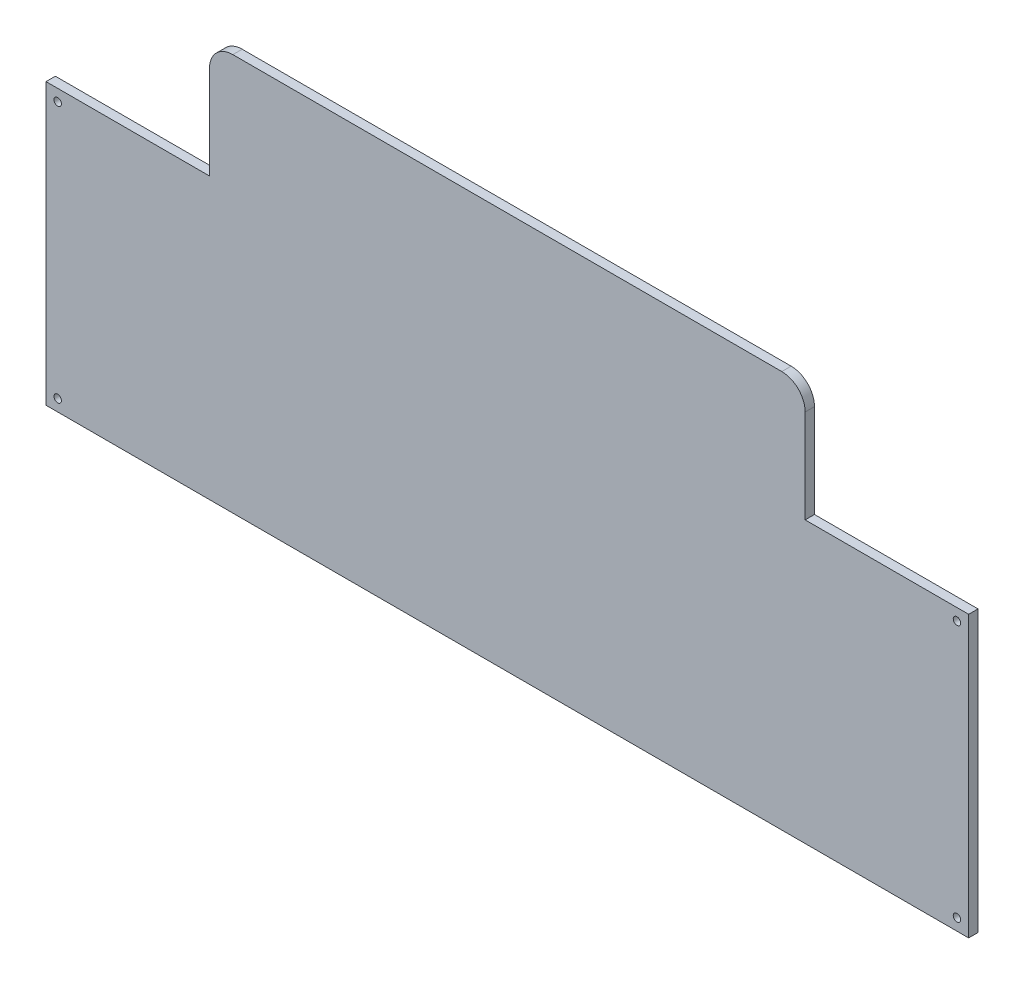
ISO-10303-21;
HEADER;
FILE_DESCRIPTION(('STEP AP214'),'2;1');
FILE_NAME('part.step','',(''),(''),'','','');
FILE_SCHEMA(('AUTOMOTIVE_DESIGN { 1 0 10303 214 1 1 1 1 }'));
ENDSEC;
DATA;
#1=APPLICATION_CONTEXT('core data for automotive mechanical design processes');
#2=APPLICATION_PROTOCOL_DEFINITION('international standard','automotive_design',2000,#1);
#3=PRODUCT_CONTEXT('',#1,'mechanical');
#4=PRODUCT('Part','Part','',(#3));
#5=PRODUCT_RELATED_PRODUCT_CATEGORY('part','',(#4));
#6=PRODUCT_DEFINITION_FORMATION('','',#4);
#7=PRODUCT_DEFINITION_CONTEXT('part definition',#1,'design');
#8=PRODUCT_DEFINITION('design','',#6,#7);
#9=PRODUCT_DEFINITION_SHAPE('','',#8);
#10=(LENGTH_UNIT() NAMED_UNIT(*) SI_UNIT(.MILLI.,.METRE.));
#11=(NAMED_UNIT(*) PLANE_ANGLE_UNIT() SI_UNIT($,.RADIAN.));
#12=(NAMED_UNIT(*) SI_UNIT($,.STERADIAN.) SOLID_ANGLE_UNIT());
#13=UNCERTAINTY_MEASURE_WITH_UNIT(LENGTH_MEASURE(1.E-05),#10,'distance_accuracy_value','');
#14=(GEOMETRIC_REPRESENTATION_CONTEXT(3) GLOBAL_UNCERTAINTY_ASSIGNED_CONTEXT((#13)) GLOBAL_UNIT_ASSIGNED_CONTEXT((#10,
#11,#12)) REPRESENTATION_CONTEXT('',''));
#15=CARTESIAN_POINT('',(0.,0.,0.));
#16=DIRECTION('',(0.,0.,1.));
#17=DIRECTION('',(1.,0.,0.));
#18=AXIS2_PLACEMENT_3D('',#15,#16,#17);
#19=CARTESIAN_POINT('',(-117.5,100.,4.));
#20=DIRECTION('',(0.,0.,-1.));
#21=DIRECTION('',(-1.,0.,0.));
#22=AXIS2_PLACEMENT_3D('',#19,#20,#21);
#23=PLANE('',#22);
#24=DIRECTION('',(0.,1.,0.));
#25=VECTOR('',#24,1.);
#26=CARTESIAN_POINT('',(197.5,60.,4.));
#27=LINE('',#26,#25);
#28=CARTESIAN_POINT('',(197.5,-60.,4.));
#29=VERTEX_POINT('',#28);
#30=CARTESIAN_POINT('',(197.5,60.,4.));
#31=VERTEX_POINT('',#30);
#32=EDGE_CURVE('E163',#29,#31,#27,.T.);
#33=ORIENTED_EDGE('',*,*,#32,.T.);
#34=DIRECTION('',(-1.,0.,0.));
#35=VECTOR('',#34,1.);
#36=CARTESIAN_POINT('',(127.5,60.,4.));
#37=LINE('',#36,#35);
#38=CARTESIAN_POINT('',(127.5,60.,4.));
#39=VERTEX_POINT('',#38);
#40=EDGE_CURVE('E101',#31,#39,#37,.T.);
#41=ORIENTED_EDGE('',*,*,#40,.T.);
#42=DIRECTION('',(0.,1.,0.));
#43=VECTOR('',#42,1.);
#44=CARTESIAN_POINT('',(127.5,100.,4.));
#45=LINE('',#44,#43);
#46=CARTESIAN_POINT('',(127.5,100.,4.));
#47=VERTEX_POINT('',#46);
#48=EDGE_CURVE('E184',#39,#47,#45,.T.);
#49=ORIENTED_EDGE('',*,*,#48,.T.);
#50=CARTESIAN_POINT('',(117.5,100.,4.));
#51=DIRECTION('',(0.,0.,1.));
#52=DIRECTION('',(-1.,0.,0.));
#53=AXIS2_PLACEMENT_3D('',#50,#51,#52);
#54=CIRCLE('',#53,10.);
#55=CARTESIAN_POINT('',(117.5,110.,4.));
#56=VERTEX_POINT('',#55);
#57=EDGE_CURVE('E203',#47,#56,#54,.T.);
#58=ORIENTED_EDGE('',*,*,#57,.T.);
#59=DIRECTION('',(-1.,0.,0.));
#60=VECTOR('',#59,1.);
#61=CARTESIAN_POINT('',(-117.5,110.,4.));
#62=LINE('',#61,#60);
#63=CARTESIAN_POINT('',(-117.5,110.,4.));
#64=VERTEX_POINT('',#63);
#65=EDGE_CURVE('E200',#56,#64,#62,.T.);
#66=ORIENTED_EDGE('',*,*,#65,.T.);
#67=CARTESIAN_POINT('',(-117.5,100.,4.));
#68=DIRECTION('',(0.,0.,1.));
#69=DIRECTION('',(-1.,0.,0.));
#70=AXIS2_PLACEMENT_3D('',#67,#68,#69);
#71=CIRCLE('',#70,10.);
#72=CARTESIAN_POINT('',(-127.5,100.,4.));
#73=VERTEX_POINT('',#72);
#74=EDGE_CURVE('E202',#64,#73,#71,.T.);
#75=ORIENTED_EDGE('',*,*,#74,.T.);
#76=DIRECTION('',(0.,-1.,0.));
#77=VECTOR('',#76,1.);
#78=CARTESIAN_POINT('',(-127.5,60.,4.));
#79=LINE('',#78,#77);
#80=CARTESIAN_POINT('',(-127.5,60.,4.));
#81=VERTEX_POINT('',#80);
#82=EDGE_CURVE('E126',#73,#81,#79,.T.);
#83=ORIENTED_EDGE('',*,*,#82,.T.);
#84=DIRECTION('',(-1.,0.,0.));
#85=VECTOR('',#84,1.);
#86=CARTESIAN_POINT('',(-197.5,60.,4.));
#87=LINE('',#86,#85);
#88=CARTESIAN_POINT('',(-197.5,60.,4.));
#89=VERTEX_POINT('',#88);
#90=EDGE_CURVE('E120',#81,#89,#87,.T.);
#91=ORIENTED_EDGE('',*,*,#90,.T.);
#92=DIRECTION('',(0.,-1.,0.));
#93=VECTOR('',#92,1.);
#94=CARTESIAN_POINT('',(-197.5,60.,4.));
#95=LINE('',#94,#93);
#96=CARTESIAN_POINT('',(-197.5,-60.,4.));
#97=VERTEX_POINT('',#96);
#98=EDGE_CURVE('E124',#89,#97,#95,.T.);
#99=ORIENTED_EDGE('',*,*,#98,.T.);
#100=DIRECTION('',(1.,0.,0.));
#101=VECTOR('',#100,1.);
#102=CARTESIAN_POINT('',(-197.5,-60.,4.));
#103=LINE('',#102,#101);
#104=EDGE_CURVE('E52',#97,#29,#103,.T.);
#105=ORIENTED_EDGE('',*,*,#104,.T.);
#106=EDGE_LOOP('',(#33,#41,#49,#58,#66,#75,#83,#91,#99,#105));
#107=FACE_BOUND('',#106,.T.);
#108=CARTESIAN_POINT('',(-192.5,55.,4.));
#109=DIRECTION('',(0.,0.,1.));
#110=DIRECTION('',(1.,0.,0.));
#111=AXIS2_PLACEMENT_3D('',#108,#109,#110);
#112=CIRCLE('',#111,1.59999999999999);
#113=CARTESIAN_POINT('',(-190.9,55.,4.));
#114=VERTEX_POINT('',#113);
#115=EDGE_CURVE('E148',#114,#114,#112,.T.);
#116=ORIENTED_EDGE('',*,*,#115,.F.);
#117=EDGE_LOOP('',(#116));
#118=FACE_BOUND('',#117,.T.);
#119=CARTESIAN_POINT('',(192.5,55.,4.));
#120=DIRECTION('',(0.,0.,1.));
#121=DIRECTION('',(-1.,0.,0.));
#122=AXIS2_PLACEMENT_3D('',#119,#120,#121);
#123=CIRCLE('',#122,1.59999999999999);
#124=CARTESIAN_POINT('',(190.9,55.,4.));
#125=VERTEX_POINT('',#124);
#126=EDGE_CURVE('E214',#125,#125,#123,.T.);
#127=ORIENTED_EDGE('',*,*,#126,.F.);
#128=EDGE_LOOP('',(#127));
#129=FACE_BOUND('',#128,.T.);
#130=CARTESIAN_POINT('',(192.5,-55.,4.));
#131=DIRECTION('',(0.,0.,1.));
#132=DIRECTION('',(1.,0.,0.));
#133=AXIS2_PLACEMENT_3D('',#130,#131,#132);
#134=CIRCLE('',#133,1.59999999999999);
#135=CARTESIAN_POINT('',(194.1,-55.,4.));
#136=VERTEX_POINT('',#135);
#137=EDGE_CURVE('E220',#136,#136,#134,.T.);
#138=ORIENTED_EDGE('',*,*,#137,.F.);
#139=EDGE_LOOP('',(#138));
#140=FACE_BOUND('',#139,.T.);
#141=CARTESIAN_POINT('',(-192.5,-55.,4.));
#142=DIRECTION('',(0.,0.,1.));
#143=DIRECTION('',(-1.,0.,0.));
#144=AXIS2_PLACEMENT_3D('',#141,#142,#143);
#145=CIRCLE('',#144,1.59999999999999);
#146=CARTESIAN_POINT('',(-194.1,-55.,4.));
#147=VERTEX_POINT('',#146);
#148=EDGE_CURVE('E226',#147,#147,#145,.T.);
#149=ORIENTED_EDGE('',*,*,#148,.F.);
#150=EDGE_LOOP('',(#149));
#151=FACE_BOUND('',#150,.T.);
#152=ADVANCED_FACE('F35',(#107,#118,#129,#140,#151),#23,.F.);
#153=CARTESIAN_POINT('',(-117.5,100.,0.));
#154=DIRECTION('',(0.,0.,-1.));
#155=DIRECTION('',(-1.,0.,0.));
#156=AXIS2_PLACEMENT_3D('',#153,#154,#155);
#157=PLANE('',#156);
#158=CARTESIAN_POINT('',(192.5,-55.,0.));
#159=DIRECTION('',(0.,0.,1.));
#160=DIRECTION('',(1.,0.,0.));
#161=AXIS2_PLACEMENT_3D('',#158,#159,#160);
#162=CIRCLE('',#161,1.59999999999999);
#163=CARTESIAN_POINT('',(194.1,-55.,0.));
#164=VERTEX_POINT('',#163);
#165=EDGE_CURVE('E223',#164,#164,#162,.T.);
#166=ORIENTED_EDGE('',*,*,#165,.T.);
#167=EDGE_LOOP('',(#166));
#168=FACE_BOUND('',#167,.T.);
#169=CARTESIAN_POINT('',(-192.5,55.,0.));
#170=DIRECTION('',(0.,0.,1.));
#171=DIRECTION('',(1.,0.,0.));
#172=AXIS2_PLACEMENT_3D('',#169,#170,#171);
#173=CIRCLE('',#172,1.59999999999999);
#174=CARTESIAN_POINT('',(-190.9,55.,0.));
#175=VERTEX_POINT('',#174);
#176=EDGE_CURVE('E211',#175,#175,#173,.T.);
#177=ORIENTED_EDGE('',*,*,#176,.T.);
#178=EDGE_LOOP('',(#177));
#179=FACE_BOUND('',#178,.T.);
#180=DIRECTION('',(0.,1.,0.));
#181=VECTOR('',#180,1.);
#182=CARTESIAN_POINT('',(197.5,60.,0.));
#183=LINE('',#182,#181);
#184=CARTESIAN_POINT('',(197.5,-60.,0.));
#185=VERTEX_POINT('',#184);
#186=CARTESIAN_POINT('',(197.5,60.,0.));
#187=VERTEX_POINT('',#186);
#188=EDGE_CURVE('E144',#185,#187,#183,.T.);
#189=ORIENTED_EDGE('',*,*,#188,.F.);
#190=DIRECTION('',(1.,0.,0.));
#191=VECTOR('',#190,1.);
#192=CARTESIAN_POINT('',(-197.5,-60.,0.));
#193=LINE('',#192,#191);
#194=CARTESIAN_POINT('',(-197.5,-60.,0.));
#195=VERTEX_POINT('',#194);
#196=EDGE_CURVE('E93',#195,#185,#193,.T.);
#197=ORIENTED_EDGE('',*,*,#196,.F.);
#198=DIRECTION('',(0.,-1.,0.));
#199=VECTOR('',#198,1.);
#200=CARTESIAN_POINT('',(-197.5,60.,0.));
#201=LINE('',#200,#199);
#202=CARTESIAN_POINT('',(-197.5,60.,0.));
#203=VERTEX_POINT('',#202);
#204=EDGE_CURVE('E87',#203,#195,#201,.T.);
#205=ORIENTED_EDGE('',*,*,#204,.F.);
#206=DIRECTION('',(-1.,0.,0.));
#207=VECTOR('',#206,1.);
#208=CARTESIAN_POINT('',(-197.5,60.,0.));
#209=LINE('',#208,#207);
#210=CARTESIAN_POINT('',(-127.5,60.,0.));
#211=VERTEX_POINT('',#210);
#212=EDGE_CURVE('E134',#211,#203,#209,.T.);
#213=ORIENTED_EDGE('',*,*,#212,.F.);
#214=DIRECTION('',(0.,-1.,0.));
#215=VECTOR('',#214,1.);
#216=CARTESIAN_POINT('',(-127.5,60.,0.));
#217=LINE('',#216,#215);
#218=CARTESIAN_POINT('',(-127.5,100.,0.));
#219=VERTEX_POINT('',#218);
#220=EDGE_CURVE('E158',#219,#211,#217,.T.);
#221=ORIENTED_EDGE('',*,*,#220,.F.);
#222=CARTESIAN_POINT('',(-117.5,100.,0.));
#223=DIRECTION('',(0.,0.,1.));
#224=DIRECTION('',(-1.,0.,0.));
#225=AXIS2_PLACEMENT_3D('',#222,#223,#224);
#226=CIRCLE('',#225,10.);
#227=CARTESIAN_POINT('',(-117.5,110.,0.));
#228=VERTEX_POINT('',#227);
#229=EDGE_CURVE('E156',#228,#219,#226,.T.);
#230=ORIENTED_EDGE('',*,*,#229,.F.);
#231=DIRECTION('',(-1.,0.,0.));
#232=VECTOR('',#231,1.);
#233=CARTESIAN_POINT('',(-117.5,110.,0.));
#234=LINE('',#233,#232);
#235=CARTESIAN_POINT('',(117.5,110.,0.));
#236=VERTEX_POINT('',#235);
#237=EDGE_CURVE('E154',#236,#228,#234,.T.);
#238=ORIENTED_EDGE('',*,*,#237,.F.);
#239=CARTESIAN_POINT('',(117.5,100.,0.));
#240=DIRECTION('',(0.,0.,1.));
#241=DIRECTION('',(-1.,0.,0.));
#242=AXIS2_PLACEMENT_3D('',#239,#240,#241);
#243=CIRCLE('',#242,10.);
#244=CARTESIAN_POINT('',(127.5,100.,0.));
#245=VERTEX_POINT('',#244);
#246=EDGE_CURVE('E152',#245,#236,#243,.T.);
#247=ORIENTED_EDGE('',*,*,#246,.F.);
#248=DIRECTION('',(0.,1.,0.));
#249=VECTOR('',#248,1.);
#250=CARTESIAN_POINT('',(127.5,100.,0.));
#251=LINE('',#250,#249);
#252=CARTESIAN_POINT('',(127.5,60.,0.));
#253=VERTEX_POINT('',#252);
#254=EDGE_CURVE('E150',#253,#245,#251,.T.);
#255=ORIENTED_EDGE('',*,*,#254,.F.);
#256=DIRECTION('',(-1.,0.,0.));
#257=VECTOR('',#256,1.);
#258=CARTESIAN_POINT('',(127.5,60.,0.));
#259=LINE('',#258,#257);
#260=EDGE_CURVE('E147',#187,#253,#259,.T.);
#261=ORIENTED_EDGE('',*,*,#260,.F.);
#262=EDGE_LOOP('',(#189,#197,#205,#213,#221,#230,#238,#247,#255,#261));
#263=FACE_BOUND('',#262,.T.);
#264=CARTESIAN_POINT('',(192.5,55.,0.));
#265=DIRECTION('',(0.,0.,1.));
#266=DIRECTION('',(-1.,0.,0.));
#267=AXIS2_PLACEMENT_3D('',#264,#265,#266);
#268=CIRCLE('',#267,1.59999999999999);
#269=CARTESIAN_POINT('',(190.9,55.,0.));
#270=VERTEX_POINT('',#269);
#271=EDGE_CURVE('E217',#270,#270,#268,.T.);
#272=ORIENTED_EDGE('',*,*,#271,.T.);
#273=EDGE_LOOP('',(#272));
#274=FACE_BOUND('',#273,.T.);
#275=CARTESIAN_POINT('',(-192.5,-55.,0.));
#276=DIRECTION('',(0.,0.,1.));
#277=DIRECTION('',(-1.,0.,0.));
#278=AXIS2_PLACEMENT_3D('',#275,#276,#277);
#279=CIRCLE('',#278,1.59999999999999);
#280=CARTESIAN_POINT('',(-194.1,-55.,0.));
#281=VERTEX_POINT('',#280);
#282=EDGE_CURVE('E229',#281,#281,#279,.T.);
#283=ORIENTED_EDGE('',*,*,#282,.T.);
#284=EDGE_LOOP('',(#283));
#285=FACE_BOUND('',#284,.T.);
#286=ADVANCED_FACE('F188',(#168,#179,#263,#274,#285),#157,.T.);
#287=CARTESIAN_POINT('',(197.5,60.,4.));
#288=DIRECTION('',(-1.,0.,0.));
#289=DIRECTION('',(0.,0.,1.));
#290=AXIS2_PLACEMENT_3D('',#287,#288,#289);
#291=PLANE('',#290);
#292=ORIENTED_EDGE('',*,*,#188,.T.);
#293=DIRECTION('',(0.,0.,-1.));
#294=VECTOR('',#293,1.);
#295=CARTESIAN_POINT('',(197.5,60.,4.));
#296=LINE('',#295,#294);
#297=EDGE_CURVE('E11',#31,#187,#296,.T.);
#298=ORIENTED_EDGE('',*,*,#297,.F.);
#299=ORIENTED_EDGE('',*,*,#32,.F.);
#300=DIRECTION('',(0.,0.,-1.));
#301=VECTOR('',#300,1.);
#302=CARTESIAN_POINT('',(197.5,-60.,4.));
#303=LINE('',#302,#301);
#304=EDGE_CURVE('E140',#29,#185,#303,.T.);
#305=ORIENTED_EDGE('',*,*,#304,.T.);
#306=EDGE_LOOP('',(#292,#298,#299,#305));
#307=FACE_BOUND('',#306,.T.);
#308=ADVANCED_FACE('F37',(#307),#291,.F.);
#309=CARTESIAN_POINT('',(127.5,60.,4.));
#310=DIRECTION('',(0.,-1.,0.));
#311=DIRECTION('',(0.,0.,-1.));
#312=AXIS2_PLACEMENT_3D('',#309,#310,#311);
#313=PLANE('',#312);
#314=ORIENTED_EDGE('',*,*,#260,.T.);
#315=DIRECTION('',(0.,0.,-1.));
#316=VECTOR('',#315,1.);
#317=CARTESIAN_POINT('',(127.5,60.,4.));
#318=LINE('',#317,#316);
#319=EDGE_CURVE('E44',#39,#253,#318,.T.);
#320=ORIENTED_EDGE('',*,*,#319,.F.);
#321=ORIENTED_EDGE('',*,*,#40,.F.);
#322=ORIENTED_EDGE('',*,*,#297,.T.);
#323=EDGE_LOOP('',(#314,#320,#321,#322));
#324=FACE_BOUND('',#323,.T.);
#325=ADVANCED_FACE('F269',(#324),#313,.F.);
#326=CARTESIAN_POINT('',(127.5,100.,4.));
#327=DIRECTION('',(-1.,0.,0.));
#328=DIRECTION('',(0.,0.,1.));
#329=AXIS2_PLACEMENT_3D('',#326,#327,#328);
#330=PLANE('',#329);
#331=ORIENTED_EDGE('',*,*,#254,.T.);
#332=DIRECTION('',(0.,0.,-1.));
#333=VECTOR('',#332,1.);
#334=CARTESIAN_POINT('',(127.5,100.,4.));
#335=LINE('',#334,#333);
#336=EDGE_CURVE('E176',#47,#245,#335,.T.);
#337=ORIENTED_EDGE('',*,*,#336,.F.);
#338=ORIENTED_EDGE('',*,*,#48,.F.);
#339=ORIENTED_EDGE('',*,*,#319,.T.);
#340=EDGE_LOOP('',(#331,#337,#338,#339));
#341=FACE_BOUND('',#340,.T.);
#342=ADVANCED_FACE('F182',(#341),#330,.F.);
#343=CARTESIAN_POINT('',(117.5,100.,4.));
#344=DIRECTION('',(0.,0.,-1.));
#345=DIRECTION('',(-1.,0.,0.));
#346=AXIS2_PLACEMENT_3D('',#343,#344,#345);
#347=CYLINDRICAL_SURFACE('',#346,10.);
#348=ORIENTED_EDGE('',*,*,#246,.T.);
#349=DIRECTION('',(0.,0.,-1.));
#350=VECTOR('',#349,1.);
#351=CARTESIAN_POINT('',(117.5,110.,4.));
#352=LINE('',#351,#350);
#353=EDGE_CURVE('E173',#56,#236,#352,.T.);
#354=ORIENTED_EDGE('',*,*,#353,.F.);
#355=ORIENTED_EDGE('',*,*,#57,.F.);
#356=ORIENTED_EDGE('',*,*,#336,.T.);
#357=EDGE_LOOP('',(#348,#354,#355,#356));
#358=FACE_BOUND('',#357,.T.);
#359=ADVANCED_FACE('F194',(#358),#347,.T.);
#360=CARTESIAN_POINT('',(-117.5,110.,4.));
#361=DIRECTION('',(0.,-1.,0.));
#362=DIRECTION('',(0.,0.,-1.));
#363=AXIS2_PLACEMENT_3D('',#360,#361,#362);
#364=PLANE('',#363);
#365=ORIENTED_EDGE('',*,*,#237,.T.);
#366=DIRECTION('',(0.,0.,-1.));
#367=VECTOR('',#366,1.);
#368=CARTESIAN_POINT('',(-117.5,110.,4.));
#369=LINE('',#368,#367);
#370=EDGE_CURVE('E170',#64,#228,#369,.T.);
#371=ORIENTED_EDGE('',*,*,#370,.F.);
#372=ORIENTED_EDGE('',*,*,#65,.F.);
#373=ORIENTED_EDGE('',*,*,#353,.T.);
#374=EDGE_LOOP('',(#365,#371,#372,#373));
#375=FACE_BOUND('',#374,.T.);
#376=ADVANCED_FACE('F198',(#375),#364,.F.);
#377=CARTESIAN_POINT('',(-117.5,100.,4.));
#378=DIRECTION('',(0.,0.,-1.));
#379=DIRECTION('',(-1.,0.,0.));
#380=AXIS2_PLACEMENT_3D('',#377,#378,#379);
#381=CYLINDRICAL_SURFACE('',#380,10.);
#382=ORIENTED_EDGE('',*,*,#229,.T.);
#383=DIRECTION('',(0.,0.,-1.));
#384=VECTOR('',#383,1.);
#385=CARTESIAN_POINT('',(-127.5,100.,4.));
#386=LINE('',#385,#384);
#387=EDGE_CURVE('E167',#73,#219,#386,.T.);
#388=ORIENTED_EDGE('',*,*,#387,.F.);
#389=ORIENTED_EDGE('',*,*,#74,.F.);
#390=ORIENTED_EDGE('',*,*,#370,.T.);
#391=EDGE_LOOP('',(#382,#388,#389,#390));
#392=FACE_BOUND('',#391,.T.);
#393=ADVANCED_FACE('F259',(#392),#381,.T.);
#394=CARTESIAN_POINT('',(-127.5,60.,4.));
#395=DIRECTION('',(1.,0.,0.));
#396=DIRECTION('',(0.,0.,-1.));
#397=AXIS2_PLACEMENT_3D('',#394,#395,#396);
#398=PLANE('',#397);
#399=ORIENTED_EDGE('',*,*,#220,.T.);
#400=DIRECTION('',(0.,0.,-1.));
#401=VECTOR('',#400,1.);
#402=CARTESIAN_POINT('',(-127.5,60.,4.));
#403=LINE('',#402,#401);
#404=EDGE_CURVE('E135',#81,#211,#403,.T.);
#405=ORIENTED_EDGE('',*,*,#404,.F.);
#406=ORIENTED_EDGE('',*,*,#82,.F.);
#407=ORIENTED_EDGE('',*,*,#387,.T.);
#408=EDGE_LOOP('',(#399,#405,#406,#407));
#409=FACE_BOUND('',#408,.T.);
#410=ADVANCED_FACE('F256',(#409),#398,.F.);
#411=CARTESIAN_POINT('',(-197.5,60.,4.));
#412=DIRECTION('',(0.,-1.,0.));
#413=DIRECTION('',(0.,0.,-1.));
#414=AXIS2_PLACEMENT_3D('',#411,#412,#413);
#415=PLANE('',#414);
#416=ORIENTED_EDGE('',*,*,#212,.T.);
#417=DIRECTION('',(0.,0.,-1.));
#418=VECTOR('',#417,1.);
#419=CARTESIAN_POINT('',(-197.5,60.,4.));
#420=LINE('',#419,#418);
#421=EDGE_CURVE('E131',#89,#203,#420,.T.);
#422=ORIENTED_EDGE('',*,*,#421,.F.);
#423=ORIENTED_EDGE('',*,*,#90,.F.);
#424=ORIENTED_EDGE('',*,*,#404,.T.);
#425=EDGE_LOOP('',(#416,#422,#423,#424));
#426=FACE_BOUND('',#425,.T.);
#427=ADVANCED_FACE('F132',(#426),#415,.F.);
#428=CARTESIAN_POINT('',(-197.5,60.,4.));
#429=DIRECTION('',(1.,0.,0.));
#430=DIRECTION('',(0.,1.,0.));
#431=AXIS2_PLACEMENT_3D('',#428,#429,#430);
#432=PLANE('',#431);
#433=ORIENTED_EDGE('',*,*,#204,.T.);
#434=DIRECTION('',(0.,0.,-1.));
#435=VECTOR('',#434,1.);
#436=CARTESIAN_POINT('',(-197.5,-60.,4.));
#437=LINE('',#436,#435);
#438=EDGE_CURVE('E136',#97,#195,#437,.T.);
#439=ORIENTED_EDGE('',*,*,#438,.F.);
#440=ORIENTED_EDGE('',*,*,#98,.F.);
#441=ORIENTED_EDGE('',*,*,#421,.T.);
#442=EDGE_LOOP('',(#433,#439,#440,#441));
#443=FACE_BOUND('',#442,.T.);
#444=ADVANCED_FACE('F138',(#443),#432,.F.);
#445=CARTESIAN_POINT('',(-197.5,-60.,4.));
#446=DIRECTION('',(0.,1.,0.));
#447=DIRECTION('',(0.,0.,1.));
#448=AXIS2_PLACEMENT_3D('',#445,#446,#447);
#449=PLANE('',#448);
#450=ORIENTED_EDGE('',*,*,#196,.T.);
#451=ORIENTED_EDGE('',*,*,#304,.F.);
#452=ORIENTED_EDGE('',*,*,#104,.F.);
#453=ORIENTED_EDGE('',*,*,#438,.T.);
#454=EDGE_LOOP('',(#450,#451,#452,#453));
#455=FACE_BOUND('',#454,.T.);
#456=ADVANCED_FACE('F249',(#455),#449,.F.);
#457=CARTESIAN_POINT('',(-192.5,55.,4.));
#458=DIRECTION('',(0.,0.,-1.));
#459=DIRECTION('',(-1.,0.,0.));
#460=AXIS2_PLACEMENT_3D('',#457,#458,#459);
#461=CYLINDRICAL_SURFACE('',#460,1.59999999999999);
#462=ORIENTED_EDGE('',*,*,#115,.T.);
#463=EDGE_LOOP('',(#462));
#464=FACE_BOUND('',#463,.T.);
#465=ORIENTED_EDGE('',*,*,#176,.F.);
#466=EDGE_LOOP('',(#465));
#467=FACE_BOUND('',#466,.T.);
#468=ADVANCED_FACE('F246',(#464,#467),#461,.F.);
#469=CARTESIAN_POINT('',(192.5,55.,4.));
#470=DIRECTION('',(0.,0.,-1.));
#471=DIRECTION('',(-1.,0.,0.));
#472=AXIS2_PLACEMENT_3D('',#469,#470,#471);
#473=CYLINDRICAL_SURFACE('',#472,1.59999999999999);
#474=ORIENTED_EDGE('',*,*,#126,.T.);
#475=EDGE_LOOP('',(#474));
#476=FACE_BOUND('',#475,.T.);
#477=ORIENTED_EDGE('',*,*,#271,.F.);
#478=EDGE_LOOP('',(#477));
#479=FACE_BOUND('',#478,.T.);
#480=ADVANCED_FACE('F345',(#476,#479),#473,.F.);
#481=CARTESIAN_POINT('',(192.5,-55.,4.));
#482=DIRECTION('',(0.,0.,-1.));
#483=DIRECTION('',(-1.,0.,0.));
#484=AXIS2_PLACEMENT_3D('',#481,#482,#483);
#485=CYLINDRICAL_SURFACE('',#484,1.59999999999999);
#486=ORIENTED_EDGE('',*,*,#137,.T.);
#487=EDGE_LOOP('',(#486));
#488=FACE_BOUND('',#487,.T.);
#489=ORIENTED_EDGE('',*,*,#165,.F.);
#490=EDGE_LOOP('',(#489));
#491=FACE_BOUND('',#490,.T.);
#492=ADVANCED_FACE('F353',(#488,#491),#485,.F.);
#493=CARTESIAN_POINT('',(-192.5,-55.,4.));
#494=DIRECTION('',(0.,0.,-1.));
#495=DIRECTION('',(-1.,0.,0.));
#496=AXIS2_PLACEMENT_3D('',#493,#494,#495);
#497=CYLINDRICAL_SURFACE('',#496,1.59999999999999);
#498=ORIENTED_EDGE('',*,*,#148,.T.);
#499=EDGE_LOOP('',(#498));
#500=FACE_BOUND('',#499,.T.);
#501=ORIENTED_EDGE('',*,*,#282,.F.);
#502=EDGE_LOOP('',(#501));
#503=FACE_BOUND('',#502,.T.);
#504=ADVANCED_FACE('F235',(#500,#503),#497,.F.);
#505=CLOSED_SHELL('',(#152,#286,#308,#325,#342,#359,#376,#393,#410,#427,#444,#456,#468,#480,
#492,#504));
#506=MANIFOLD_SOLID_BREP('B2',#505);
#507=ADVANCED_BREP_SHAPE_REPRESENTATION('',(#18,#506),#14);
#508=SHAPE_DEFINITION_REPRESENTATION(#9,#507);
ENDSEC;
END-ISO-10303-21;
